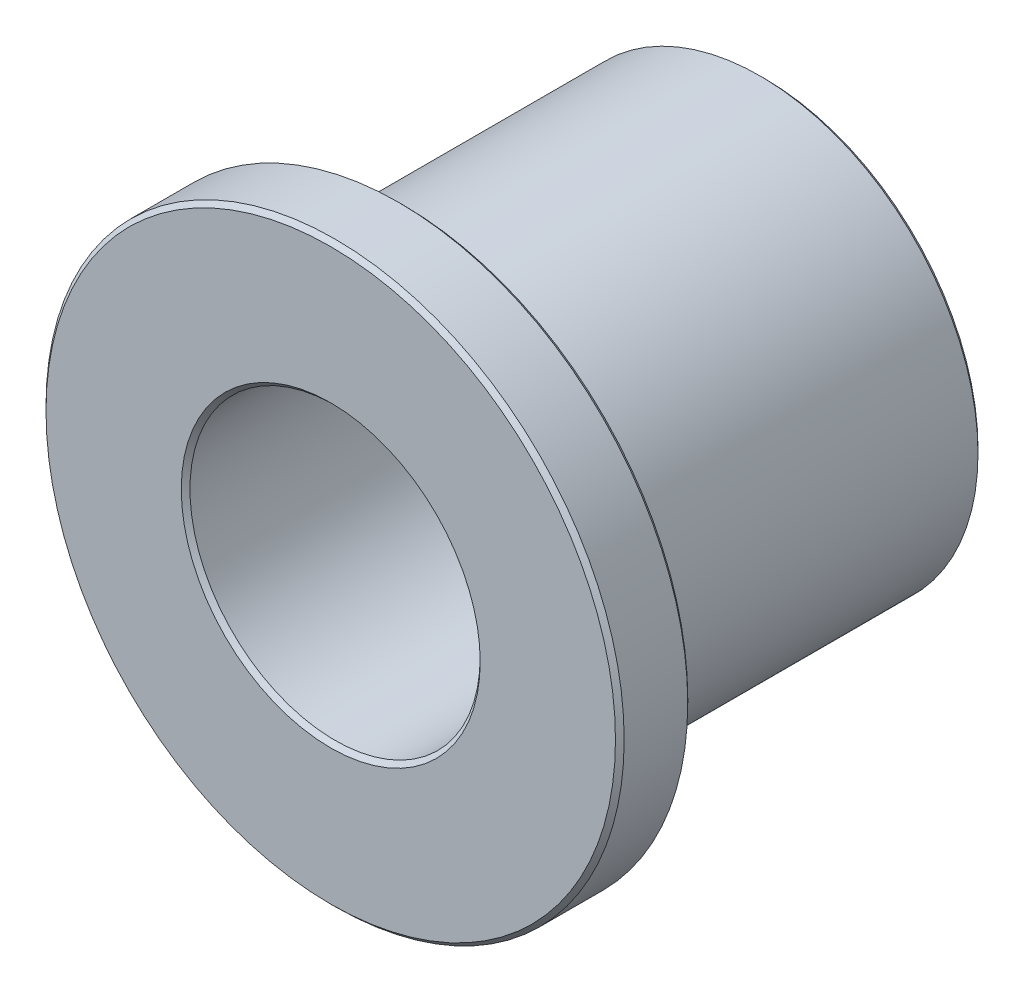
ISO-10303-21;
HEADER;
FILE_DESCRIPTION(('STEP AP214'),'2;1');
FILE_NAME('part.step','',(''),(''),'','','');
FILE_SCHEMA(('AUTOMOTIVE_DESIGN { 1 0 10303 214 1 1 1 1 }'));
ENDSEC;
DATA;
#1=APPLICATION_CONTEXT('core data for automotive mechanical design processes');
#2=APPLICATION_PROTOCOL_DEFINITION('international standard','automotive_design',2000,#1);
#3=PRODUCT_CONTEXT('',#1,'mechanical');
#4=PRODUCT('Part','Part','',(#3));
#5=PRODUCT_RELATED_PRODUCT_CATEGORY('part','',(#4));
#6=PRODUCT_DEFINITION_FORMATION('','',#4);
#7=PRODUCT_DEFINITION_CONTEXT('part definition',#1,'design');
#8=PRODUCT_DEFINITION('design','',#6,#7);
#9=PRODUCT_DEFINITION_SHAPE('','',#8);
#10=(LENGTH_UNIT() NAMED_UNIT(*) SI_UNIT(.MILLI.,.METRE.));
#11=(NAMED_UNIT(*) PLANE_ANGLE_UNIT() SI_UNIT($,.RADIAN.));
#12=(NAMED_UNIT(*) SI_UNIT($,.STERADIAN.) SOLID_ANGLE_UNIT());
#13=UNCERTAINTY_MEASURE_WITH_UNIT(LENGTH_MEASURE(1.E-05),#10,'distance_accuracy_value','');
#14=(GEOMETRIC_REPRESENTATION_CONTEXT(3) GLOBAL_UNCERTAINTY_ASSIGNED_CONTEXT((#13)) GLOBAL_UNIT_ASSIGNED_CONTEXT((#10,
#11,#12)) REPRESENTATION_CONTEXT('',''));
#15=CARTESIAN_POINT('',(0.,0.,0.));
#16=DIRECTION('',(0.,0.,1.));
#17=DIRECTION('',(1.,0.,0.));
#18=AXIS2_PLACEMENT_3D('',#15,#16,#17);
#19=CARTESIAN_POINT('',(0.,0.,3.175));
#20=DIRECTION('',(0.,0.,1.));
#21=DIRECTION('',(1.,0.,0.));
#22=AXIS2_PLACEMENT_3D('',#19,#20,#21);
#23=CYLINDRICAL_SURFACE('',#22,6.35);
#24=CARTESIAN_POINT('',(0.,0.,4.666869));
#25=DIRECTION('',(0.,0.,1.));
#26=DIRECTION('',(1.,0.,0.));
#27=AXIS2_PLACEMENT_3D('',#24,#25,#26);
#28=CIRCLE('',#27,6.35);
#29=CARTESIAN_POINT('',(6.35,0.,4.666869));
#30=VERTEX_POINT('',#29);
#31=EDGE_CURVE('E73',#30,#30,#28,.F.);
#32=ORIENTED_EDGE('',*,*,#31,.T.);
#33=EDGE_LOOP('',(#32));
#34=FACE_BOUND('',#33,.T.);
#35=CARTESIAN_POINT('',(0.,0.,3.270631));
#36=DIRECTION('',(0.,0.,1.));
#37=DIRECTION('',(1.,0.,0.));
#38=AXIS2_PLACEMENT_3D('',#35,#36,#37);
#39=CIRCLE('',#38,6.35);
#40=CARTESIAN_POINT('',(6.35,0.,3.270631));
#41=VERTEX_POINT('',#40);
#42=EDGE_CURVE('E77',#41,#41,#39,.T.);
#43=ORIENTED_EDGE('',*,*,#42,.T.);
#44=EDGE_LOOP('',(#43));
#45=FACE_BOUND('',#44,.T.);
#46=ADVANCED_FACE('F41',(#34,#45),#23,.T.);
#47=CARTESIAN_POINT('',(0.,0.,3.175));
#48=DIRECTION('',(0.,0.,1.));
#49=DIRECTION('',(1.,0.,0.));
#50=AXIS2_PLACEMENT_3D('',#47,#48,#49);
#51=PLANE('',#50);
#52=CARTESIAN_POINT('',(0.,0.,3.175));
#53=DIRECTION('',(0.,0.,1.));
#54=DIRECTION('',(1.,0.,0.));
#55=AXIS2_PLACEMENT_3D('',#52,#53,#54);
#56=CIRCLE('',#55,6.254369);
#57=CARTESIAN_POINT('',(6.254369,0.,3.175));
#58=VERTEX_POINT('',#57);
#59=EDGE_CURVE('E65',#58,#58,#56,.F.);
#60=ORIENTED_EDGE('',*,*,#59,.T.);
#61=EDGE_LOOP('',(#60));
#62=FACE_BOUND('',#61,.T.);
#63=CARTESIAN_POINT('',(0.,0.,3.175));
#64=DIRECTION('',(0.,0.,1.));
#65=DIRECTION('',(1.,0.,0.));
#66=AXIS2_PLACEMENT_3D('',#63,#64,#65);
#67=CIRCLE('',#66,4.883531);
#68=CARTESIAN_POINT('',(4.883531,0.,3.175));
#69=VERTEX_POINT('',#68);
#70=EDGE_CURVE('E69',#69,#69,#67,.T.);
#71=ORIENTED_EDGE('',*,*,#70,.T.);
#72=EDGE_LOOP('',(#71));
#73=FACE_BOUND('',#72,.T.);
#74=ADVANCED_FACE('F113',(#62,#73),#51,.F.);
#75=CARTESIAN_POINT('',(0.,0.,4.7625));
#76=DIRECTION('',(0.,0.,1.));
#77=DIRECTION('',(1.,0.,0.));
#78=AXIS2_PLACEMENT_3D('',#75,#76,#77);
#79=PLANE('',#78);
#80=CARTESIAN_POINT('',(0.,0.,4.7625));
#81=DIRECTION('',(0.,0.,1.));
#82=DIRECTION('',(1.,0.,0.));
#83=AXIS2_PLACEMENT_3D('',#80,#81,#82);
#84=CIRCLE('',#83,3.283331);
#85=CARTESIAN_POINT('',(3.283331,0.,4.7625));
#86=VERTEX_POINT('',#85);
#87=EDGE_CURVE('E81',#86,#86,#84,.F.);
#88=ORIENTED_EDGE('',*,*,#87,.T.);
#89=EDGE_LOOP('',(#88));
#90=FACE_BOUND('',#89,.T.);
#91=CARTESIAN_POINT('',(0.,0.,4.7625));
#92=DIRECTION('',(0.,0.,1.));
#93=DIRECTION('',(1.,0.,0.));
#94=AXIS2_PLACEMENT_3D('',#91,#92,#93);
#95=CIRCLE('',#94,6.254369);
#96=CARTESIAN_POINT('',(6.254369,0.,4.7625));
#97=VERTEX_POINT('',#96);
#98=EDGE_CURVE('E85',#97,#97,#95,.T.);
#99=ORIENTED_EDGE('',*,*,#98,.T.);
#100=EDGE_LOOP('',(#99));
#101=FACE_BOUND('',#100,.T.);
#102=ADVANCED_FACE('F119',(#90,#101),#79,.T.);
#103=CARTESIAN_POINT('',(0.,0.,3.175));
#104=DIRECTION('',(0.,0.,1.));
#105=DIRECTION('',(1.,0.,0.));
#106=AXIS2_PLACEMENT_3D('',#103,#104,#105);
#107=CYLINDRICAL_SURFACE('',#106,3.1877);
#108=CARTESIAN_POINT('',(0.,0.,4.666869));
#109=DIRECTION('',(0.,0.,1.));
#110=DIRECTION('',(1.,0.,0.));
#111=AXIS2_PLACEMENT_3D('',#108,#109,#110);
#112=CIRCLE('',#111,3.1877);
#113=CARTESIAN_POINT('',(3.1877,0.,4.666869));
#114=VERTEX_POINT('',#113);
#115=EDGE_CURVE('E89',#114,#114,#112,.T.);
#116=ORIENTED_EDGE('',*,*,#115,.T.);
#117=EDGE_LOOP('',(#116));
#118=FACE_BOUND('',#117,.T.);
#119=CARTESIAN_POINT('',(0.,0.,-4.666869));
#120=DIRECTION('',(0.,0.,1.));
#121=DIRECTION('',(1.,0.,0.));
#122=AXIS2_PLACEMENT_3D('',#119,#120,#121);
#123=CIRCLE('',#122,3.1877);
#124=CARTESIAN_POINT('',(3.1877,0.,-4.666869));
#125=VERTEX_POINT('',#124);
#126=EDGE_CURVE('E93',#125,#125,#123,.F.);
#127=ORIENTED_EDGE('',*,*,#126,.T.);
#128=EDGE_LOOP('',(#127));
#129=FACE_BOUND('',#128,.T.);
#130=ADVANCED_FACE('F98',(#118,#129),#107,.F.);
#131=CARTESIAN_POINT('',(0.,0.,-4.7625));
#132=DIRECTION('',(0.,0.,1.));
#133=DIRECTION('',(1.,0.,0.));
#134=AXIS2_PLACEMENT_3D('',#131,#132,#133);
#135=CYLINDRICAL_SURFACE('',#134,4.7879);
#136=CARTESIAN_POINT('',(0.,0.,3.079369));
#137=DIRECTION('',(0.,0.,1.));
#138=DIRECTION('',(1.,0.,0.));
#139=AXIS2_PLACEMENT_3D('',#136,#137,#138);
#140=CIRCLE('',#139,4.7879);
#141=CARTESIAN_POINT('',(4.7879,0.,3.079369));
#142=VERTEX_POINT('',#141);
#143=EDGE_CURVE('E54',#142,#142,#140,.F.);
#144=ORIENTED_EDGE('',*,*,#143,.T.);
#145=EDGE_LOOP('',(#144));
#146=FACE_BOUND('',#145,.T.);
#147=CARTESIAN_POINT('',(0.,0.,-4.666869));
#148=DIRECTION('',(0.,0.,1.));
#149=DIRECTION('',(1.,0.,0.));
#150=AXIS2_PLACEMENT_3D('',#147,#148,#149);
#151=CIRCLE('',#150,4.7879);
#152=CARTESIAN_POINT('',(4.7879,0.,-4.666869));
#153=VERTEX_POINT('',#152);
#154=EDGE_CURVE('E59',#153,#153,#151,.T.);
#155=ORIENTED_EDGE('',*,*,#154,.T.);
#156=EDGE_LOOP('',(#155));
#157=FACE_BOUND('',#156,.T.);
#158=ADVANCED_FACE('F168',(#146,#157),#135,.T.);
#159=CARTESIAN_POINT('',(0.,0.,-4.7625));
#160=DIRECTION('',(0.,0.,1.));
#161=DIRECTION('',(1.,0.,0.));
#162=AXIS2_PLACEMENT_3D('',#159,#160,#161);
#163=PLANE('',#162);
#164=CARTESIAN_POINT('',(0.,0.,-4.7625));
#165=DIRECTION('',(0.,0.,1.));
#166=DIRECTION('',(1.,0.,0.));
#167=AXIS2_PLACEMENT_3D('',#164,#165,#166);
#168=CIRCLE('',#167,3.283331);
#169=CARTESIAN_POINT('',(3.283331,0.,-4.7625));
#170=VERTEX_POINT('',#169);
#171=EDGE_CURVE('E10',#170,#170,#168,.T.);
#172=ORIENTED_EDGE('',*,*,#171,.T.);
#173=EDGE_LOOP('',(#172));
#174=FACE_BOUND('',#173,.T.);
#175=CARTESIAN_POINT('',(0.,0.,-4.7625));
#176=DIRECTION('',(0.,0.,1.));
#177=DIRECTION('',(1.,0.,0.));
#178=AXIS2_PLACEMENT_3D('',#175,#176,#177);
#179=CIRCLE('',#178,4.692269);
#180=CARTESIAN_POINT('',(4.692269,0.,-4.7625));
#181=VERTEX_POINT('',#180);
#182=EDGE_CURVE('E49',#181,#181,#179,.F.);
#183=ORIENTED_EDGE('',*,*,#182,.T.);
#184=EDGE_LOOP('',(#183));
#185=FACE_BOUND('',#184,.T.);
#186=ADVANCED_FACE('F129',(#174,#185),#163,.F.);
#187=CARTESIAN_POINT('',(0.,0.,4.666869));
#188=DIRECTION('',(0.,0.,1.));
#189=DIRECTION('',(1.,0.,0.));
#190=AXIS2_PLACEMENT_3D('',#187,#188,#189);
#191=CONICAL_SURFACE('',#190,3.1877,0.785398163397464);
#192=ORIENTED_EDGE('',*,*,#87,.F.);
#193=EDGE_LOOP('',(#192));
#194=FACE_BOUND('',#193,.T.);
#195=ORIENTED_EDGE('',*,*,#115,.F.);
#196=EDGE_LOOP('',(#195));
#197=FACE_BOUND('',#196,.T.);
#198=ADVANCED_FACE('F125',(#194,#197),#191,.F.);
#199=CARTESIAN_POINT('',(0.,0.,4.7625));
#200=DIRECTION('',(0.,0.,-1.));
#201=DIRECTION('',(-1.,0.,0.));
#202=AXIS2_PLACEMENT_3D('',#199,#200,#201);
#203=CONICAL_SURFACE('',#202,6.254369,0.785398163397444);
#204=ORIENTED_EDGE('',*,*,#31,.F.);
#205=EDGE_LOOP('',(#204));
#206=FACE_BOUND('',#205,.T.);
#207=ORIENTED_EDGE('',*,*,#98,.F.);
#208=EDGE_LOOP('',(#207));
#209=FACE_BOUND('',#208,.T.);
#210=ADVANCED_FACE('F128',(#206,#209),#203,.T.);
#211=CARTESIAN_POINT('',(0.,0.,3.270631));
#212=DIRECTION('',(0.,0.,1.));
#213=DIRECTION('',(1.,0.,0.));
#214=AXIS2_PLACEMENT_3D('',#211,#212,#213);
#215=CONICAL_SURFACE('',#214,6.35,0.785398163397453);
#216=ORIENTED_EDGE('',*,*,#59,.F.);
#217=EDGE_LOOP('',(#216));
#218=FACE_BOUND('',#217,.T.);
#219=ORIENTED_EDGE('',*,*,#42,.F.);
#220=EDGE_LOOP('',(#219));
#221=FACE_BOUND('',#220,.T.);
#222=ADVANCED_FACE('F109',(#218,#221),#215,.T.);
#223=CARTESIAN_POINT('',(0.,0.,3.175));
#224=DIRECTION('',(0.,0.,1.));
#225=DIRECTION('',(1.,0.,0.));
#226=AXIS2_PLACEMENT_3D('',#223,#224,#225);
#227=CONICAL_SURFACE('',#226,4.883531,0.785398163397448);
#228=ORIENTED_EDGE('',*,*,#143,.F.);
#229=EDGE_LOOP('',(#228));
#230=FACE_BOUND('',#229,.T.);
#231=ORIENTED_EDGE('',*,*,#70,.F.);
#232=EDGE_LOOP('',(#231));
#233=FACE_BOUND('',#232,.T.);
#234=ADVANCED_FACE('F103',(#230,#233),#227,.T.);
#235=CARTESIAN_POINT('',(0.,0.,-4.7625));
#236=DIRECTION('',(0.,0.,-1.));
#237=DIRECTION('',(-1.,0.,0.));
#238=AXIS2_PLACEMENT_3D('',#235,#236,#237);
#239=CONICAL_SURFACE('',#238,3.283331,0.785398163397453);
#240=ORIENTED_EDGE('',*,*,#126,.F.);
#241=EDGE_LOOP('',(#240));
#242=FACE_BOUND('',#241,.T.);
#243=ORIENTED_EDGE('',*,*,#171,.F.);
#244=EDGE_LOOP('',(#243));
#245=FACE_BOUND('',#244,.T.);
#246=ADVANCED_FACE('F100',(#242,#245),#239,.F.);
#247=CARTESIAN_POINT('',(0.,0.,-4.666869));
#248=DIRECTION('',(0.,0.,1.));
#249=DIRECTION('',(1.,0.,0.));
#250=AXIS2_PLACEMENT_3D('',#247,#248,#249);
#251=CONICAL_SURFACE('',#250,4.7879,0.785398163397444);
#252=ORIENTED_EDGE('',*,*,#182,.F.);
#253=EDGE_LOOP('',(#252));
#254=FACE_BOUND('',#253,.T.);
#255=ORIENTED_EDGE('',*,*,#154,.F.);
#256=EDGE_LOOP('',(#255));
#257=FACE_BOUND('',#256,.T.);
#258=ADVANCED_FACE('F43',(#254,#257),#251,.T.);
#259=CLOSED_SHELL('',(#46,#74,#102,#130,#158,#186,#198,#210,#222,#234,#246,#258));
#260=MANIFOLD_SOLID_BREP('B2',#259);
#261=ADVANCED_BREP_SHAPE_REPRESENTATION('',(#18,#260),#14);
#262=SHAPE_DEFINITION_REPRESENTATION(#9,#261);
ENDSEC;
END-ISO-10303-21;
